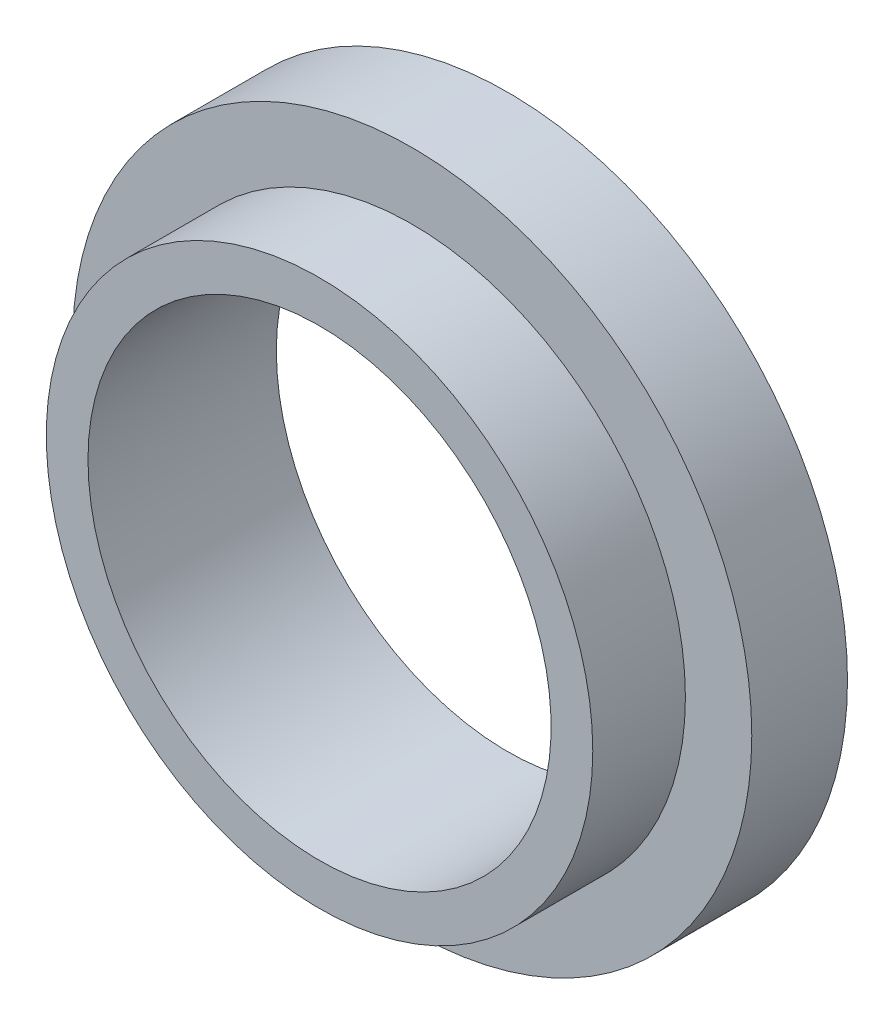
ISO-10303-21;
HEADER;
FILE_DESCRIPTION(('STEP AP214'),'2;1');
FILE_NAME('part.step','',(''),(''),'','','');
FILE_SCHEMA(('AUTOMOTIVE_DESIGN { 1 0 10303 214 1 1 1 1 }'));
ENDSEC;
DATA;
#1=APPLICATION_CONTEXT('core data for automotive mechanical design processes');
#2=APPLICATION_PROTOCOL_DEFINITION('international standard','automotive_design',2000,#1);
#3=PRODUCT_CONTEXT('',#1,'mechanical');
#4=PRODUCT('Part','Part','',(#3));
#5=PRODUCT_RELATED_PRODUCT_CATEGORY('part','',(#4));
#6=PRODUCT_DEFINITION_FORMATION('','',#4);
#7=PRODUCT_DEFINITION_CONTEXT('part definition',#1,'design');
#8=PRODUCT_DEFINITION('design','',#6,#7);
#9=PRODUCT_DEFINITION_SHAPE('','',#8);
#10=(LENGTH_UNIT() NAMED_UNIT(*) SI_UNIT(.MILLI.,.METRE.));
#11=(NAMED_UNIT(*) PLANE_ANGLE_UNIT() SI_UNIT($,.RADIAN.));
#12=(NAMED_UNIT(*) SI_UNIT($,.STERADIAN.) SOLID_ANGLE_UNIT());
#13=UNCERTAINTY_MEASURE_WITH_UNIT(LENGTH_MEASURE(1.E-05),#10,'distance_accuracy_value','');
#14=(GEOMETRIC_REPRESENTATION_CONTEXT(3) GLOBAL_UNCERTAINTY_ASSIGNED_CONTEXT((#13)) GLOBAL_UNIT_ASSIGNED_CONTEXT((#10,
#11,#12)) REPRESENTATION_CONTEXT('',''));
#15=CARTESIAN_POINT('',(0.,0.,0.));
#16=DIRECTION('',(0.,0.,1.));
#17=DIRECTION('',(1.,0.,0.));
#18=AXIS2_PLACEMENT_3D('',#15,#16,#17);
#19=CARTESIAN_POINT('',(0.,0.,15.5));
#20=DIRECTION('',(0.,0.,-1.));
#21=DIRECTION('',(-1.,0.,0.));
#22=AXIS2_PLACEMENT_3D('',#19,#20,#21);
#23=CYLINDRICAL_SURFACE('',#22,55.);
#24=CARTESIAN_POINT('',(0.,0.,15.5));
#25=DIRECTION('',(0.,0.,1.));
#26=DIRECTION('',(1.,0.,0.));
#27=AXIS2_PLACEMENT_3D('',#24,#25,#26);
#28=CIRCLE('',#27,55.);
#29=CARTESIAN_POINT('',(55.,0.,15.5));
#30=VERTEX_POINT('',#29);
#31=EDGE_CURVE('E38',#30,#30,#28,.T.);
#32=ORIENTED_EDGE('',*,*,#31,.F.);
#33=EDGE_LOOP('',(#32));
#34=FACE_BOUND('',#33,.T.);
#35=CARTESIAN_POINT('',(0.,0.,0.));
#36=DIRECTION('',(0.,0.,1.));
#37=DIRECTION('',(1.,0.,0.));
#38=AXIS2_PLACEMENT_3D('',#35,#36,#37);
#39=CIRCLE('',#38,55.);
#40=CARTESIAN_POINT('',(55.,0.,0.));
#41=VERTEX_POINT('',#40);
#42=EDGE_CURVE('E34',#41,#41,#39,.T.);
#43=ORIENTED_EDGE('',*,*,#42,.T.);
#44=EDGE_LOOP('',(#43));
#45=FACE_BOUND('',#44,.T.);
#46=ADVANCED_FACE('F31',(#34,#45),#23,.T.);
#47=CARTESIAN_POINT('',(0.,0.,15.5));
#48=DIRECTION('',(0.,0.,1.));
#49=DIRECTION('',(1.,0.,0.));
#50=AXIS2_PLACEMENT_3D('',#47,#48,#49);
#51=PLANE('',#50);
#52=CARTESIAN_POINT('',(0.,0.,15.5));
#53=DIRECTION('',(0.,0.,1.));
#54=DIRECTION('',(1.,0.,0.));
#55=AXIS2_PLACEMENT_3D('',#52,#53,#54);
#56=CIRCLE('',#55,44.25);
#57=CARTESIAN_POINT('',(44.25,0.,15.5));
#58=VERTEX_POINT('',#57);
#59=EDGE_CURVE('E10',#58,#58,#56,.T.);
#60=ORIENTED_EDGE('',*,*,#59,.F.);
#61=EDGE_LOOP('',(#60));
#62=FACE_BOUND('',#61,.T.);
#63=ORIENTED_EDGE('',*,*,#31,.T.);
#64=EDGE_LOOP('',(#63));
#65=FACE_BOUND('',#64,.T.);
#66=ADVANCED_FACE('F67',(#62,#65),#51,.T.);
#67=CARTESIAN_POINT('',(0.,0.,0.));
#68=DIRECTION('',(0.,0.,1.));
#69=DIRECTION('',(1.,0.,0.));
#70=AXIS2_PLACEMENT_3D('',#67,#68,#69);
#71=PLANE('',#70);
#72=CARTESIAN_POINT('',(0.,0.,0.));
#73=DIRECTION('',(0.,0.,1.));
#74=DIRECTION('',(1.,0.,0.));
#75=AXIS2_PLACEMENT_3D('',#72,#73,#74);
#76=CIRCLE('',#75,37.5);
#77=CARTESIAN_POINT('',(-37.5,0.,0.));
#78=VERTEX_POINT('',#77);
#79=EDGE_CURVE('E47',#78,#78,#76,.T.);
#80=ORIENTED_EDGE('',*,*,#79,.T.);
#81=EDGE_LOOP('',(#80));
#82=FACE_BOUND('',#81,.T.);
#83=ORIENTED_EDGE('',*,*,#42,.F.);
#84=EDGE_LOOP('',(#83));
#85=FACE_BOUND('',#84,.T.);
#86=ADVANCED_FACE('F63',(#82,#85),#71,.F.);
#87=CARTESIAN_POINT('',(0.,0.,30.5));
#88=DIRECTION('',(0.,0.,-1.));
#89=DIRECTION('',(-1.,0.,0.));
#90=AXIS2_PLACEMENT_3D('',#87,#88,#89);
#91=CYLINDRICAL_SURFACE('',#90,44.25);
#92=CARTESIAN_POINT('',(0.,0.,30.5));
#93=DIRECTION('',(0.,0.,1.));
#94=DIRECTION('',(1.,0.,0.));
#95=AXIS2_PLACEMENT_3D('',#92,#93,#94);
#96=CIRCLE('',#95,44.25);
#97=CARTESIAN_POINT('',(44.25,0.,30.5));
#98=VERTEX_POINT('',#97);
#99=EDGE_CURVE('E44',#98,#98,#96,.T.);
#100=ORIENTED_EDGE('',*,*,#99,.F.);
#101=EDGE_LOOP('',(#100));
#102=FACE_BOUND('',#101,.T.);
#103=ORIENTED_EDGE('',*,*,#59,.T.);
#104=EDGE_LOOP('',(#103));
#105=FACE_BOUND('',#104,.T.);
#106=ADVANCED_FACE('F66',(#102,#105),#91,.T.);
#107=CARTESIAN_POINT('',(0.,0.,30.5));
#108=DIRECTION('',(0.,0.,1.));
#109=DIRECTION('',(1.,0.,0.));
#110=AXIS2_PLACEMENT_3D('',#107,#108,#109);
#111=PLANE('',#110);
#112=CARTESIAN_POINT('',(0.,0.,30.5));
#113=DIRECTION('',(0.,0.,-1.));
#114=DIRECTION('',(-1.,0.,0.));
#115=AXIS2_PLACEMENT_3D('',#112,#113,#114);
#116=CIRCLE('',#115,37.5);
#117=CARTESIAN_POINT('',(-37.5,0.,30.5));
#118=VERTEX_POINT('',#117);
#119=EDGE_CURVE('E50',#118,#118,#116,.T.);
#120=ORIENTED_EDGE('',*,*,#119,.T.);
#121=EDGE_LOOP('',(#120));
#122=FACE_BOUND('',#121,.T.);
#123=ORIENTED_EDGE('',*,*,#99,.T.);
#124=EDGE_LOOP('',(#123));
#125=FACE_BOUND('',#124,.T.);
#126=ADVANCED_FACE('F54',(#122,#125),#111,.T.);
#127=CARTESIAN_POINT('',(0.,0.,30.5));
#128=DIRECTION('',(0.,0.,-1.));
#129=DIRECTION('',(-1.,0.,0.));
#130=AXIS2_PLACEMENT_3D('',#127,#128,#129);
#131=CYLINDRICAL_SURFACE('',#130,37.5);
#132=CARTESIAN_POINT('',(-37.5,0.,30.5));
#133=CARTESIAN_POINT('',(-37.5,0.,30.1822916666667));
#134=CARTESIAN_POINT('',(-37.5,0.,29.8645833333333));
#135=CARTESIAN_POINT('',(-37.5,0.,29.2291666666667));
#136=CARTESIAN_POINT('',(-37.5,0.,28.9114583333333));
#137=CARTESIAN_POINT('',(-37.5,0.,28.2760416666667));
#138=CARTESIAN_POINT('',(-37.5,0.,27.9583333333333));
#139=CARTESIAN_POINT('',(-37.5,0.,27.3229166666667));
#140=CARTESIAN_POINT('',(-37.5,0.,27.0052083333333));
#141=CARTESIAN_POINT('',(-37.5,0.,26.3697916666667));
#142=CARTESIAN_POINT('',(-37.5,0.,26.0520833333333));
#143=CARTESIAN_POINT('',(-37.5,0.,25.4166666666667));
#144=CARTESIAN_POINT('',(-37.5,0.,25.0989583333333));
#145=CARTESIAN_POINT('',(-37.5,0.,24.4635416666667));
#146=CARTESIAN_POINT('',(-37.5,0.,24.1458333333333));
#147=CARTESIAN_POINT('',(-37.5,0.,23.5104166666667));
#148=CARTESIAN_POINT('',(-37.5,0.,23.1927083333333));
#149=CARTESIAN_POINT('',(-37.5,0.,22.5572916666667));
#150=CARTESIAN_POINT('',(-37.5,0.,22.2395833333333));
#151=CARTESIAN_POINT('',(-37.5,0.,21.6041666666667));
#152=CARTESIAN_POINT('',(-37.5,0.,21.2864583333333));
#153=CARTESIAN_POINT('',(-37.5,0.,20.6510416666667));
#154=CARTESIAN_POINT('',(-37.5,0.,20.3333333333333));
#155=CARTESIAN_POINT('',(-37.5,0.,19.6979166666667));
#156=CARTESIAN_POINT('',(-37.5,0.,19.3802083333333));
#157=CARTESIAN_POINT('',(-37.5,0.,18.7447916666667));
#158=CARTESIAN_POINT('',(-37.5,0.,18.4270833333333));
#159=CARTESIAN_POINT('',(-37.5,0.,17.7916666666667));
#160=CARTESIAN_POINT('',(-37.5,0.,17.4739583333333));
#161=CARTESIAN_POINT('',(-37.5,0.,16.8385416666667));
#162=CARTESIAN_POINT('',(-37.5,0.,16.5208333333333));
#163=CARTESIAN_POINT('',(-37.5,0.,15.8854166666667));
#164=CARTESIAN_POINT('',(-37.5,0.,15.5677083333333));
#165=CARTESIAN_POINT('',(-37.5,0.,14.9322916666667));
#166=CARTESIAN_POINT('',(-37.5,0.,14.6145833333333));
#167=CARTESIAN_POINT('',(-37.5,0.,13.9791666666667));
#168=CARTESIAN_POINT('',(-37.5,0.,13.6614583333333));
#169=CARTESIAN_POINT('',(-37.5,0.,13.0260416666667));
#170=CARTESIAN_POINT('',(-37.5,0.,12.7083333333333));
#171=CARTESIAN_POINT('',(-37.5,0.,12.0729166666667));
#172=CARTESIAN_POINT('',(-37.5,0.,11.7552083333333));
#173=CARTESIAN_POINT('',(-37.5,0.,11.1197916666667));
#174=CARTESIAN_POINT('',(-37.5,0.,10.8020833333333));
#175=CARTESIAN_POINT('',(-37.5,0.,10.1666666666667));
#176=CARTESIAN_POINT('',(-37.5,0.,9.84895833333333));
#177=CARTESIAN_POINT('',(-37.5,0.,9.21354166666666));
#178=CARTESIAN_POINT('',(-37.5,0.,8.89583333333333));
#179=CARTESIAN_POINT('',(-37.5,0.,8.26041666666667));
#180=CARTESIAN_POINT('',(-37.5,0.,7.94270833333333));
#181=CARTESIAN_POINT('',(-37.5,0.,7.30729166666667));
#182=CARTESIAN_POINT('',(-37.5,0.,6.98958333333333));
#183=CARTESIAN_POINT('',(-37.5,0.,6.35416666666666));
#184=CARTESIAN_POINT('',(-37.5,0.,6.03645833333333));
#185=CARTESIAN_POINT('',(-37.5,0.,5.40104166666667));
#186=CARTESIAN_POINT('',(-37.5,0.,5.08333333333333));
#187=CARTESIAN_POINT('',(-37.5,0.,4.44791666666667));
#188=CARTESIAN_POINT('',(-37.5,0.,4.13020833333333));
#189=CARTESIAN_POINT('',(-37.5,0.,3.49479166666666));
#190=CARTESIAN_POINT('',(-37.5,0.,3.17708333333333));
#191=CARTESIAN_POINT('',(-37.5,0.,2.54166666666666));
#192=CARTESIAN_POINT('',(-37.5,0.,2.22395833333333));
#193=CARTESIAN_POINT('',(-37.5,0.,1.58854166666666));
#194=CARTESIAN_POINT('',(-37.5,0.,1.27083333333333));
#195=CARTESIAN_POINT('',(-37.5,0.,0.635416666666662));
#196=CARTESIAN_POINT('',(-37.5,0.,0.317708333333329));
#197=CARTESIAN_POINT('',(-37.5,0.,0.));
#198=B_SPLINE_CURVE_WITH_KNOTS('',3,(#132,#133,#134,#135,#136,#137,#138,#139,#140,#141,#142,
#143,#144,#145,#146,#147,#148,#149,#150,#151,#152,#153,#154,#155,#156,#157,#158,#159,#160,#161,
#162,#163,#164,#165,#166,#167,#168,#169,#170,#171,#172,#173,#174,#175,#176,#177,#178,#179,#180,
#181,#182,#183,#184,#185,#186,#187,#188,#189,#190,#191,#192,#193,#194,#195,#196,#197),
.UNSPECIFIED.,.F.,.F.,(4,2,2,2,2,2,2,2,2,2,2,2,2,2,2,2,2,2,2,2,2,2,2,2,2,2,2,2,2,2,2,2,4),(0.,
0.953125000000003,1.90625,2.859375,3.8125,4.765625,5.71875,6.671875,7.625,8.578125,9.53125,
10.484375,11.4375,12.390625,13.34375,14.296875,15.25,16.203125,17.15625,18.109375,19.0625,
20.015625,20.96875,21.921875,22.875,23.828125,24.78125,25.734375,26.6875,27.640625,28.59375,
29.546875,30.5),.UNSPECIFIED.);
#199=EDGE_CURVE('BSEAM57',#118,#78,#198,.T.);
#200=ORIENTED_EDGE('',*,*,#119,.F.);
#201=ORIENTED_EDGE('',*,*,#79,.F.);
#202=ORIENTED_EDGE('',*,*,#199,.T.);
#203=ORIENTED_EDGE('',*,*,#199,.F.);
#204=EDGE_LOOP('',(#200,#202,#201,#203));
#205=FACE_BOUND('',#204,.T.);
#206=ADVANCED_FACE('F57',(#205),#131,.F.);
#207=CLOSED_SHELL('',(#46,#66,#86,#106,#126,#206));
#208=MANIFOLD_SOLID_BREP('B2',#207);
#209=ADVANCED_BREP_SHAPE_REPRESENTATION('',(#18,#208),#14);
#210=SHAPE_DEFINITION_REPRESENTATION(#9,#209);
ENDSEC;
END-ISO-10303-21;
